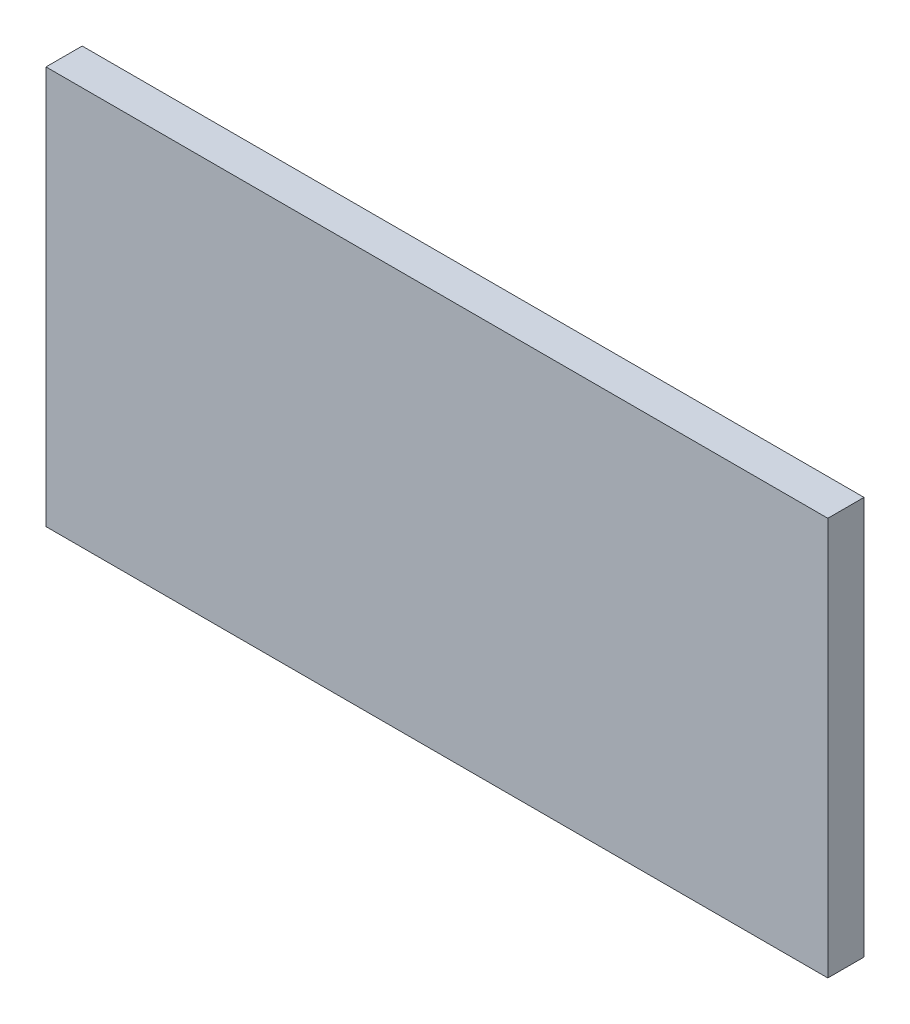
ISO-10303-21;
HEADER;
FILE_DESCRIPTION(('STEP AP214'),'2;1');
FILE_NAME('part.step','',(''),(''),'','','');
FILE_SCHEMA(('AUTOMOTIVE_DESIGN { 1 0 10303 214 1 1 1 1 }'));
ENDSEC;
DATA;
#1=APPLICATION_CONTEXT('core data for automotive mechanical design processes');
#2=APPLICATION_PROTOCOL_DEFINITION('international standard','automotive_design',2000,#1);
#3=PRODUCT_CONTEXT('',#1,'mechanical');
#4=PRODUCT('Part','Part','',(#3));
#5=PRODUCT_RELATED_PRODUCT_CATEGORY('part','',(#4));
#6=PRODUCT_DEFINITION_FORMATION('','',#4);
#7=PRODUCT_DEFINITION_CONTEXT('part definition',#1,'design');
#8=PRODUCT_DEFINITION('design','',#6,#7);
#9=PRODUCT_DEFINITION_SHAPE('','',#8);
#10=(LENGTH_UNIT() NAMED_UNIT(*) SI_UNIT(.MILLI.,.METRE.));
#11=(NAMED_UNIT(*) PLANE_ANGLE_UNIT() SI_UNIT($,.RADIAN.));
#12=(NAMED_UNIT(*) SI_UNIT($,.STERADIAN.) SOLID_ANGLE_UNIT());
#13=UNCERTAINTY_MEASURE_WITH_UNIT(LENGTH_MEASURE(1.E-05),#10,'distance_accuracy_value','');
#14=(GEOMETRIC_REPRESENTATION_CONTEXT(3) GLOBAL_UNCERTAINTY_ASSIGNED_CONTEXT((#13)) GLOBAL_UNIT_ASSIGNED_CONTEXT((#10,
#11,#12)) REPRESENTATION_CONTEXT('',''));
#15=CARTESIAN_POINT('',(0.,0.,0.));
#16=DIRECTION('',(0.,0.,1.));
#17=DIRECTION('',(1.,0.,0.));
#18=AXIS2_PLACEMENT_3D('',#15,#16,#17);
#19=CARTESIAN_POINT('',(54.,27.5,5.));
#20=DIRECTION('',(-1.,0.,0.));
#21=DIRECTION('',(0.,-1.,0.));
#22=AXIS2_PLACEMENT_3D('',#19,#20,#21);
#23=PLANE('',#22);
#24=DIRECTION('',(0.,1.,0.));
#25=VECTOR('',#24,1.);
#26=CARTESIAN_POINT('',(54.,27.5,0.));
#27=LINE('',#26,#25);
#28=CARTESIAN_POINT('',(54.,-27.5,0.));
#29=VERTEX_POINT('',#28);
#30=CARTESIAN_POINT('',(54.,27.5,0.));
#31=VERTEX_POINT('',#30);
#32=EDGE_CURVE('E96',#29,#31,#27,.T.);
#33=ORIENTED_EDGE('',*,*,#32,.T.);
#34=DIRECTION('',(0.,0.,-1.));
#35=VECTOR('',#34,1.);
#36=CARTESIAN_POINT('',(54.,27.5,5.));
#37=LINE('',#36,#35);
#38=CARTESIAN_POINT('',(54.,27.5,5.));
#39=VERTEX_POINT('',#38);
#40=EDGE_CURVE('E11',#39,#31,#37,.T.);
#41=ORIENTED_EDGE('',*,*,#40,.F.);
#42=DIRECTION('',(0.,1.,0.));
#43=VECTOR('',#42,1.);
#44=CARTESIAN_POINT('',(54.,27.5,5.));
#45=LINE('',#44,#43);
#46=CARTESIAN_POINT('',(54.,-27.5,5.));
#47=VERTEX_POINT('',#46);
#48=EDGE_CURVE('E84',#47,#39,#45,.T.);
#49=ORIENTED_EDGE('',*,*,#48,.F.);
#50=DIRECTION('',(0.,0.,-1.));
#51=VECTOR('',#50,1.);
#52=CARTESIAN_POINT('',(54.,-27.5,5.));
#53=LINE('',#52,#51);
#54=EDGE_CURVE('E92',#47,#29,#53,.T.);
#55=ORIENTED_EDGE('',*,*,#54,.T.);
#56=EDGE_LOOP('',(#33,#41,#49,#55));
#57=FACE_BOUND('',#56,.T.);
#58=ADVANCED_FACE('F33',(#57),#23,.F.);
#59=CARTESIAN_POINT('',(-54.,27.5,5.));
#60=DIRECTION('',(0.,-1.,0.));
#61=DIRECTION('',(0.,0.,-1.));
#62=AXIS2_PLACEMENT_3D('',#59,#60,#61);
#63=PLANE('',#62);
#64=DIRECTION('',(-1.,0.,0.));
#65=VECTOR('',#64,1.);
#66=CARTESIAN_POINT('',(-54.,27.5,0.));
#67=LINE('',#66,#65);
#68=CARTESIAN_POINT('',(-54.,27.5,0.));
#69=VERTEX_POINT('',#68);
#70=EDGE_CURVE('E88',#31,#69,#67,.T.);
#71=ORIENTED_EDGE('',*,*,#70,.T.);
#72=DIRECTION('',(0.,0.,-1.));
#73=VECTOR('',#72,1.);
#74=CARTESIAN_POINT('',(-54.,27.5,5.));
#75=LINE('',#74,#73);
#76=CARTESIAN_POINT('',(-54.,27.5,5.));
#77=VERTEX_POINT('',#76);
#78=EDGE_CURVE('E41',#77,#69,#75,.T.);
#79=ORIENTED_EDGE('',*,*,#78,.F.);
#80=DIRECTION('',(-1.,0.,0.));
#81=VECTOR('',#80,1.);
#82=CARTESIAN_POINT('',(-54.,27.5,5.));
#83=LINE('',#82,#81);
#84=EDGE_CURVE('E79',#39,#77,#83,.T.);
#85=ORIENTED_EDGE('',*,*,#84,.F.);
#86=ORIENTED_EDGE('',*,*,#40,.T.);
#87=EDGE_LOOP('',(#71,#79,#85,#86));
#88=FACE_BOUND('',#87,.T.);
#89=ADVANCED_FACE('F87',(#88),#63,.F.);
#90=CARTESIAN_POINT('',(-54.,27.5,5.));
#91=DIRECTION('',(1.,0.,0.));
#92=DIRECTION('',(0.,0.,-1.));
#93=AXIS2_PLACEMENT_3D('',#90,#91,#92);
#94=PLANE('',#93);
#95=DIRECTION('',(0.,-1.,0.));
#96=VECTOR('',#95,1.);
#97=CARTESIAN_POINT('',(-54.,27.5,0.));
#98=LINE('',#97,#96);
#99=CARTESIAN_POINT('',(-54.,-27.5,0.));
#100=VERTEX_POINT('',#99);
#101=EDGE_CURVE('E66',#69,#100,#98,.T.);
#102=ORIENTED_EDGE('',*,*,#101,.T.);
#103=DIRECTION('',(0.,0.,-1.));
#104=VECTOR('',#103,1.);
#105=CARTESIAN_POINT('',(-54.,-27.5,5.));
#106=LINE('',#105,#104);
#107=CARTESIAN_POINT('',(-54.,-27.5,5.));
#108=VERTEX_POINT('',#107);
#109=EDGE_CURVE('E89',#108,#100,#106,.T.);
#110=ORIENTED_EDGE('',*,*,#109,.F.);
#111=DIRECTION('',(0.,-1.,0.));
#112=VECTOR('',#111,1.);
#113=CARTESIAN_POINT('',(-54.,27.5,5.));
#114=LINE('',#113,#112);
#115=EDGE_CURVE('E82',#77,#108,#114,.T.);
#116=ORIENTED_EDGE('',*,*,#115,.F.);
#117=ORIENTED_EDGE('',*,*,#78,.T.);
#118=EDGE_LOOP('',(#102,#110,#116,#117));
#119=FACE_BOUND('',#118,.T.);
#120=ADVANCED_FACE('F90',(#119),#94,.F.);
#121=CARTESIAN_POINT('',(-54.,-27.5,5.));
#122=DIRECTION('',(0.,1.,0.));
#123=DIRECTION('',(0.,0.,1.));
#124=AXIS2_PLACEMENT_3D('',#121,#122,#123);
#125=PLANE('',#124);
#126=DIRECTION('',(1.,0.,0.));
#127=VECTOR('',#126,1.);
#128=CARTESIAN_POINT('',(-54.,-27.5,0.));
#129=LINE('',#128,#127);
#130=EDGE_CURVE('E72',#100,#29,#129,.T.);
#131=ORIENTED_EDGE('',*,*,#130,.T.);
#132=ORIENTED_EDGE('',*,*,#54,.F.);
#133=DIRECTION('',(1.,0.,0.));
#134=VECTOR('',#133,1.);
#135=CARTESIAN_POINT('',(-54.,-27.5,5.));
#136=LINE('',#135,#134);
#137=EDGE_CURVE('E49',#108,#47,#136,.T.);
#138=ORIENTED_EDGE('',*,*,#137,.F.);
#139=ORIENTED_EDGE('',*,*,#109,.T.);
#140=EDGE_LOOP('',(#131,#132,#138,#139));
#141=FACE_BOUND('',#140,.T.);
#142=ADVANCED_FACE('F103',(#141),#125,.F.);
#143=CARTESIAN_POINT('',(0.,0.,5.));
#144=DIRECTION('',(0.,0.,1.));
#145=DIRECTION('',(1.,0.,0.));
#146=AXIS2_PLACEMENT_3D('',#143,#144,#145);
#147=PLANE('',#146);
#148=ORIENTED_EDGE('',*,*,#48,.T.);
#149=ORIENTED_EDGE('',*,*,#84,.T.);
#150=ORIENTED_EDGE('',*,*,#115,.T.);
#151=ORIENTED_EDGE('',*,*,#137,.T.);
#152=EDGE_LOOP('',(#148,#149,#150,#151));
#153=FACE_BOUND('',#152,.T.);
#154=ADVANCED_FACE('F80',(#153),#147,.T.);
#155=CARTESIAN_POINT('',(0.,0.,0.));
#156=DIRECTION('',(0.,0.,1.));
#157=DIRECTION('',(1.,0.,0.));
#158=AXIS2_PLACEMENT_3D('',#155,#156,#157);
#159=PLANE('',#158);
#160=ORIENTED_EDGE('',*,*,#32,.F.);
#161=ORIENTED_EDGE('',*,*,#130,.F.);
#162=ORIENTED_EDGE('',*,*,#101,.F.);
#163=ORIENTED_EDGE('',*,*,#70,.F.);
#164=EDGE_LOOP('',(#160,#161,#162,#163));
#165=FACE_BOUND('',#164,.T.);
#166=ADVANCED_FACE('F106',(#165),#159,.F.);
#167=CLOSED_SHELL('',(#58,#89,#120,#142,#154,#166));
#168=MANIFOLD_SOLID_BREP('B2',#167);
#169=ADVANCED_BREP_SHAPE_REPRESENTATION('',(#18,#168),#14);
#170=SHAPE_DEFINITION_REPRESENTATION(#9,#169);
ENDSEC;
END-ISO-10303-21;
